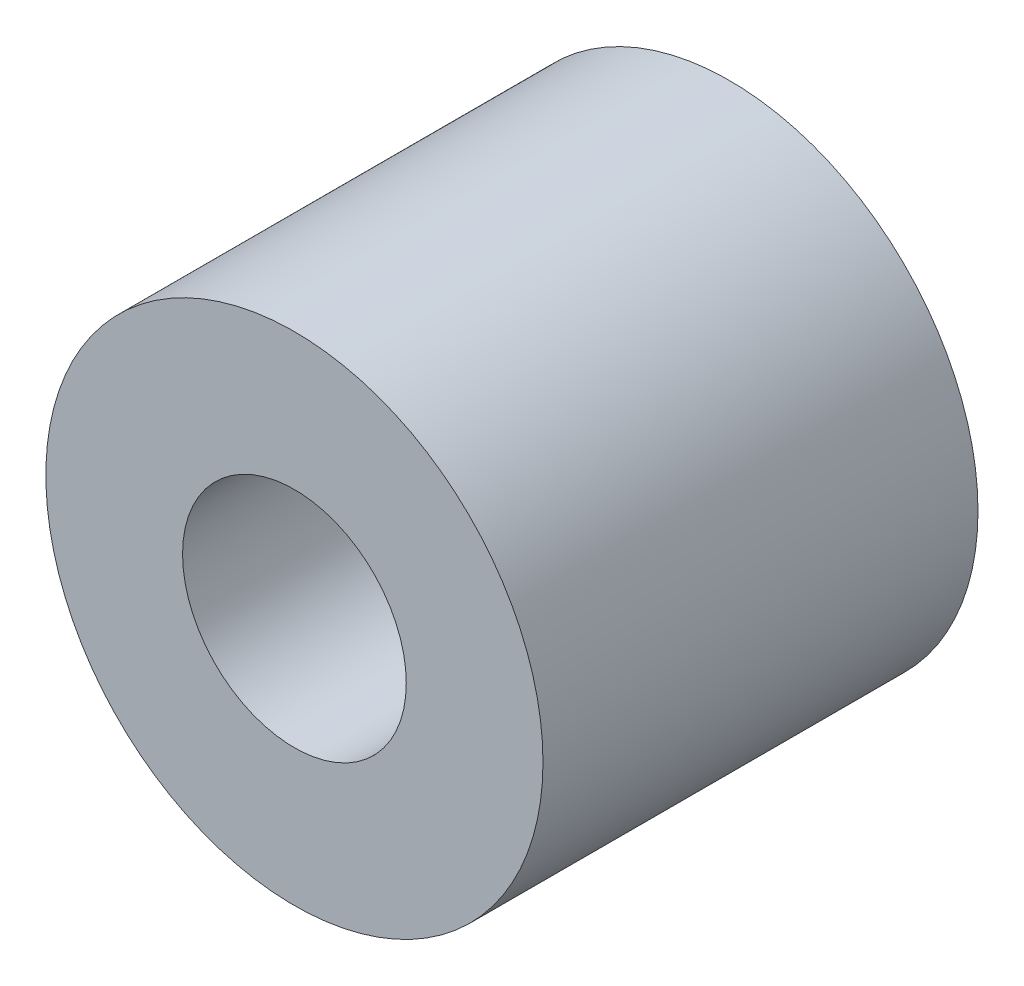
ISO-10303-21;
HEADER;
FILE_DESCRIPTION(('STEP AP214'),'2;1');
FILE_NAME('part.step','',(''),(''),'','','');
FILE_SCHEMA(('AUTOMOTIVE_DESIGN { 1 0 10303 214 1 1 1 1 }'));
ENDSEC;
DATA;
#1=APPLICATION_CONTEXT('core data for automotive mechanical design processes');
#2=APPLICATION_PROTOCOL_DEFINITION('international standard','automotive_design',2000,#1);
#3=PRODUCT_CONTEXT('',#1,'mechanical');
#4=PRODUCT('Part','Part','',(#3));
#5=PRODUCT_RELATED_PRODUCT_CATEGORY('part','',(#4));
#6=PRODUCT_DEFINITION_FORMATION('','',#4);
#7=PRODUCT_DEFINITION_CONTEXT('part definition',#1,'design');
#8=PRODUCT_DEFINITION('design','',#6,#7);
#9=PRODUCT_DEFINITION_SHAPE('','',#8);
#10=(LENGTH_UNIT() NAMED_UNIT(*) SI_UNIT(.MILLI.,.METRE.));
#11=(NAMED_UNIT(*) PLANE_ANGLE_UNIT() SI_UNIT($,.RADIAN.));
#12=(NAMED_UNIT(*) SI_UNIT($,.STERADIAN.) SOLID_ANGLE_UNIT());
#13=UNCERTAINTY_MEASURE_WITH_UNIT(LENGTH_MEASURE(1.E-05),#10,'distance_accuracy_value','');
#14=(GEOMETRIC_REPRESENTATION_CONTEXT(3) GLOBAL_UNCERTAINTY_ASSIGNED_CONTEXT((#13)) GLOBAL_UNIT_ASSIGNED_CONTEXT((#10,
#11,#12)) REPRESENTATION_CONTEXT('',''));
#15=CARTESIAN_POINT('',(0.,0.,0.));
#16=DIRECTION('',(0.,0.,1.));
#17=DIRECTION('',(1.,0.,0.));
#18=AXIS2_PLACEMENT_3D('',#15,#16,#17);
#19=CARTESIAN_POINT('',(0.,0.,3.5));
#20=DIRECTION('',(0.,0.,1.));
#21=DIRECTION('',(1.,0.,0.));
#22=AXIS2_PLACEMENT_3D('',#19,#20,#21);
#23=PLANE('',#22);
#24=CARTESIAN_POINT('',(0.,0.,3.5));
#25=DIRECTION('',(0.,0.,1.));
#26=DIRECTION('',(1.,0.,0.));
#27=AXIS2_PLACEMENT_3D('',#24,#25,#26);
#28=CIRCLE('',#27,2.);
#29=CARTESIAN_POINT('',(2.,0.,3.5));
#30=VERTEX_POINT('',#29);
#31=EDGE_CURVE('E10',#30,#30,#28,.T.);
#32=ORIENTED_EDGE('',*,*,#31,.T.);
#33=EDGE_LOOP('',(#32));
#34=FACE_BOUND('',#33,.T.);
#35=CARTESIAN_POINT('',(0.,0.,3.5));
#36=DIRECTION('',(0.,0.,1.));
#37=DIRECTION('',(1.,0.,0.));
#38=AXIS2_PLACEMENT_3D('',#35,#36,#37);
#39=CIRCLE('',#38,0.9);
#40=CARTESIAN_POINT('',(0.9,0.,3.5));
#41=VERTEX_POINT('',#40);
#42=EDGE_CURVE('E56',#41,#41,#39,.T.);
#43=ORIENTED_EDGE('',*,*,#42,.F.);
#44=EDGE_LOOP('',(#43));
#45=FACE_BOUND('',#44,.T.);
#46=ADVANCED_FACE('F43',(#34,#45),#23,.T.);
#47=CARTESIAN_POINT('',(0.,0.,0.));
#48=DIRECTION('',(0.,0.,1.));
#49=DIRECTION('',(1.,0.,0.));
#50=AXIS2_PLACEMENT_3D('',#47,#48,#49);
#51=PLANE('',#50);
#52=CARTESIAN_POINT('',(0.,0.,0.));
#53=DIRECTION('',(0.,0.,1.));
#54=DIRECTION('',(1.,0.,0.));
#55=AXIS2_PLACEMENT_3D('',#52,#53,#54);
#56=CIRCLE('',#55,2.);
#57=CARTESIAN_POINT('',(2.,0.,0.));
#58=VERTEX_POINT('',#57);
#59=EDGE_CURVE('E47',#58,#58,#56,.T.);
#60=ORIENTED_EDGE('',*,*,#59,.F.);
#61=EDGE_LOOP('',(#60));
#62=FACE_BOUND('',#61,.T.);
#63=CARTESIAN_POINT('',(0.,0.,0.));
#64=DIRECTION('',(0.,0.,1.));
#65=DIRECTION('',(1.,0.,0.));
#66=AXIS2_PLACEMENT_3D('',#63,#64,#65);
#67=CIRCLE('',#66,0.9);
#68=CARTESIAN_POINT('',(0.9,0.,0.));
#69=VERTEX_POINT('',#68);
#70=EDGE_CURVE('E58',#69,#69,#67,.T.);
#71=ORIENTED_EDGE('',*,*,#70,.T.);
#72=EDGE_LOOP('',(#71));
#73=FACE_BOUND('',#72,.T.);
#74=ADVANCED_FACE('F70',(#62,#73),#51,.F.);
#75=CARTESIAN_POINT('',(0.,0.,3.5));
#76=DIRECTION('',(0.,0.,-1.));
#77=DIRECTION('',(-1.,0.,0.));
#78=AXIS2_PLACEMENT_3D('',#75,#76,#77);
#79=CYLINDRICAL_SURFACE('',#78,2.);
#80=ORIENTED_EDGE('',*,*,#31,.F.);
#81=EDGE_LOOP('',(#80));
#82=FACE_BOUND('',#81,.T.);
#83=ORIENTED_EDGE('',*,*,#59,.T.);
#84=EDGE_LOOP('',(#83));
#85=FACE_BOUND('',#84,.T.);
#86=ADVANCED_FACE('F45',(#82,#85),#79,.T.);
#87=CARTESIAN_POINT('',(0.,0.,3.5));
#88=DIRECTION('',(0.,0.,-1.));
#89=DIRECTION('',(-1.,0.,0.));
#90=AXIS2_PLACEMENT_3D('',#87,#88,#89);
#91=CYLINDRICAL_SURFACE('',#90,0.9);
#92=ORIENTED_EDGE('',*,*,#42,.T.);
#93=EDGE_LOOP('',(#92));
#94=FACE_BOUND('',#93,.T.);
#95=ORIENTED_EDGE('',*,*,#70,.F.);
#96=EDGE_LOOP('',(#95));
#97=FACE_BOUND('',#96,.T.);
#98=ADVANCED_FACE('F66',(#94,#97),#91,.F.);
#99=CLOSED_SHELL('',(#46,#74,#86,#98));
#100=MANIFOLD_SOLID_BREP('B2',#99);
#101=ADVANCED_BREP_SHAPE_REPRESENTATION('',(#18,#100),#14);
#102=SHAPE_DEFINITION_REPRESENTATION(#9,#101);
ENDSEC;
END-ISO-10303-21;
